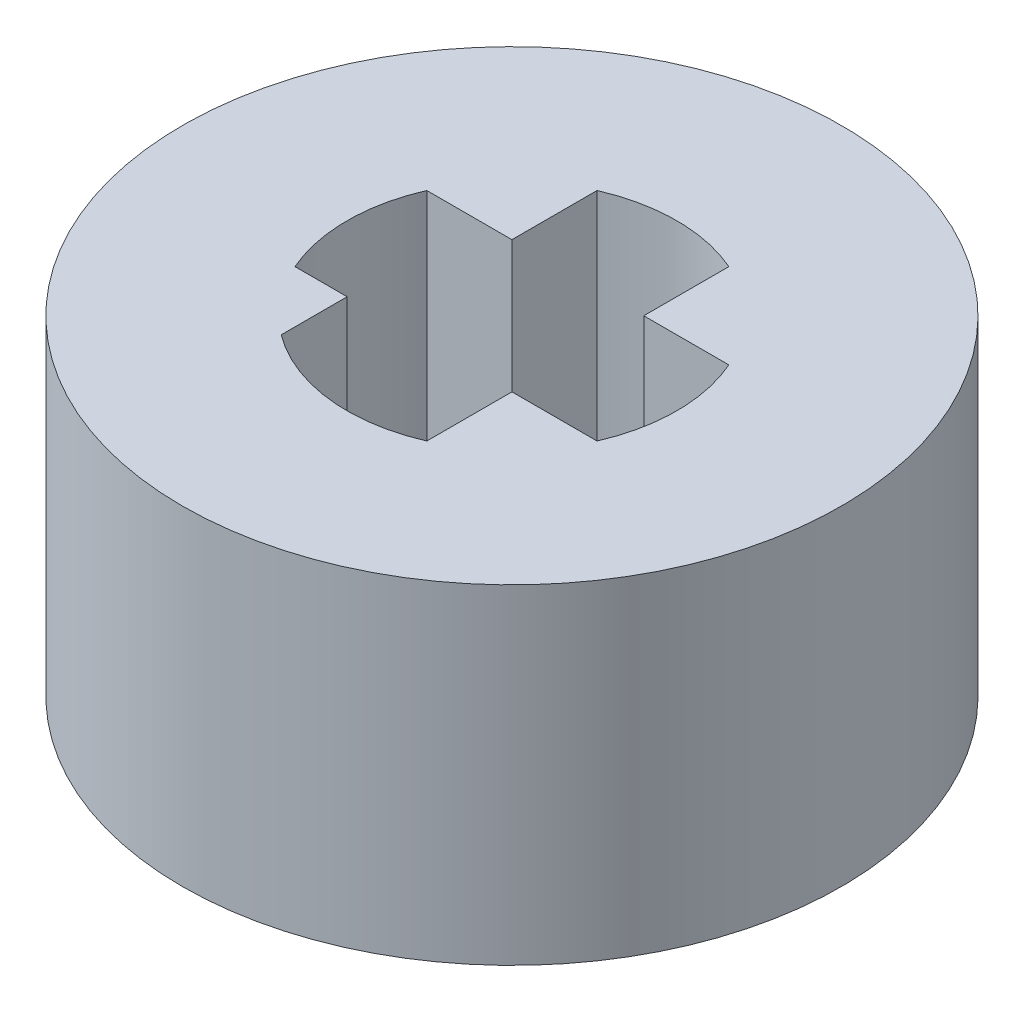
ISO-10303-21;
HEADER;
FILE_DESCRIPTION(('STEP AP214'),'2;1');
FILE_NAME('part.step','',(''),(''),'','','');
FILE_SCHEMA(('AUTOMOTIVE_DESIGN { 1 0 10303 214 1 1 1 1 }'));
ENDSEC;
DATA;
#1=APPLICATION_CONTEXT('core data for automotive mechanical design processes');
#2=APPLICATION_PROTOCOL_DEFINITION('international standard','automotive_design',2000,#1);
#3=PRODUCT_CONTEXT('',#1,'mechanical');
#4=PRODUCT('Part','Part','',(#3));
#5=PRODUCT_RELATED_PRODUCT_CATEGORY('part','',(#4));
#6=PRODUCT_DEFINITION_FORMATION('','',#4);
#7=PRODUCT_DEFINITION_CONTEXT('part definition',#1,'design');
#8=PRODUCT_DEFINITION('design','',#6,#7);
#9=PRODUCT_DEFINITION_SHAPE('','',#8);
#10=(LENGTH_UNIT() NAMED_UNIT(*) SI_UNIT(.MILLI.,.METRE.));
#11=(NAMED_UNIT(*) PLANE_ANGLE_UNIT() SI_UNIT($,.RADIAN.));
#12=(NAMED_UNIT(*) SI_UNIT($,.STERADIAN.) SOLID_ANGLE_UNIT());
#13=UNCERTAINTY_MEASURE_WITH_UNIT(LENGTH_MEASURE(1.E-05),#10,'distance_accuracy_value','');
#14=(GEOMETRIC_REPRESENTATION_CONTEXT(3) GLOBAL_UNCERTAINTY_ASSIGNED_CONTEXT((#13)) GLOBAL_UNIT_ASSIGNED_CONTEXT((#10,
#11,#12)) REPRESENTATION_CONTEXT('',''));
#15=CARTESIAN_POINT('',(0.,0.,0.));
#16=DIRECTION('',(0.,0.,1.));
#17=DIRECTION('',(1.,0.,0.));
#18=AXIS2_PLACEMENT_3D('',#15,#16,#17);
#19=CARTESIAN_POINT('',(0.,5.,0.));
#20=DIRECTION('',(0.,1.,0.));
#21=DIRECTION('',(0.,0.,1.));
#22=AXIS2_PLACEMENT_3D('',#19,#20,#21);
#23=PLANE('',#22);
#24=CARTESIAN_POINT('',(0.,5.,0.));
#25=DIRECTION('',(0.,1.,0.));
#26=DIRECTION('',(0.,0.,1.));
#27=AXIS2_PLACEMENT_3D('',#24,#25,#26);
#28=CIRCLE('',#27,5.);
#29=CARTESIAN_POINT('',(0.,5.,5.));
#30=VERTEX_POINT('',#29);
#31=EDGE_CURVE('E11',#30,#30,#28,.T.);
#32=ORIENTED_EDGE('',*,*,#31,.T.);
#33=EDGE_LOOP('',(#32));
#34=FACE_BOUND('',#33,.T.);
#35=DIRECTION('',(0.,0.,-1.));
#36=VECTOR('',#35,1.);
#37=CARTESIAN_POINT('',(1.,5.,-2.29128784747792));
#38=LINE('',#37,#36);
#39=CARTESIAN_POINT('',(1.,5.,-1.));
#40=VERTEX_POINT('',#39);
#41=CARTESIAN_POINT('',(1.,5.,-2.29128784747792));
#42=VERTEX_POINT('',#41);
#43=EDGE_CURVE('E130',#40,#42,#38,.T.);
#44=ORIENTED_EDGE('',*,*,#43,.F.);
#45=DIRECTION('',(-1.,0.,0.));
#46=VECTOR('',#45,1.);
#47=CARTESIAN_POINT('',(1.,5.,-1.));
#48=LINE('',#47,#46);
#49=CARTESIAN_POINT('',(2.29128784747792,5.,-1.));
#50=VERTEX_POINT('',#49);
#51=EDGE_CURVE('E122',#50,#40,#48,.T.);
#52=ORIENTED_EDGE('',*,*,#51,.F.);
#53=CARTESIAN_POINT('',(0.,5.,0.));
#54=DIRECTION('',(0.,1.,0.));
#55=DIRECTION('',(0.,0.,1.));
#56=AXIS2_PLACEMENT_3D('',#53,#54,#55);
#57=CIRCLE('',#56,2.5);
#58=CARTESIAN_POINT('',(2.29128784747792,5.,0.999999999999999));
#59=VERTEX_POINT('',#58);
#60=EDGE_CURVE('E162',#59,#50,#57,.T.);
#61=ORIENTED_EDGE('',*,*,#60,.F.);
#62=DIRECTION('',(1.,0.,0.));
#63=VECTOR('',#62,1.);
#64=CARTESIAN_POINT('',(1.,5.,1.));
#65=LINE('',#64,#63);
#66=CARTESIAN_POINT('',(1.,5.,1.));
#67=VERTEX_POINT('',#66);
#68=EDGE_CURVE('E160',#67,#59,#65,.T.);
#69=ORIENTED_EDGE('',*,*,#68,.F.);
#70=DIRECTION('',(0.,0.,-1.));
#71=VECTOR('',#70,1.);
#72=CARTESIAN_POINT('',(1.,5.,1.));
#73=LINE('',#72,#71);
#74=CARTESIAN_POINT('',(1.,5.,2.29128784747792));
#75=VERTEX_POINT('',#74);
#76=EDGE_CURVE('E158',#75,#67,#73,.T.);
#77=ORIENTED_EDGE('',*,*,#76,.F.);
#78=CARTESIAN_POINT('',(0.,5.,0.));
#79=DIRECTION('',(0.,1.,0.));
#80=DIRECTION('',(0.,0.,1.));
#81=AXIS2_PLACEMENT_3D('',#78,#79,#80);
#82=CIRCLE('',#81,2.5);
#83=CARTESIAN_POINT('',(-1.5,5.,2.));
#84=VERTEX_POINT('',#83);
#85=EDGE_CURVE('E156',#84,#75,#82,.T.);
#86=ORIENTED_EDGE('',*,*,#85,.F.);
#87=DIRECTION('',(0.,0.,1.));
#88=VECTOR('',#87,1.);
#89=CARTESIAN_POINT('',(-1.5,5.,1.));
#90=LINE('',#89,#88);
#91=CARTESIAN_POINT('',(-1.5,5.,1.));
#92=VERTEX_POINT('',#91);
#93=EDGE_CURVE('E154',#92,#84,#90,.T.);
#94=ORIENTED_EDGE('',*,*,#93,.F.);
#95=DIRECTION('',(1.,0.,0.));
#96=VECTOR('',#95,1.);
#97=CARTESIAN_POINT('',(-2.29128784747792,5.,1.));
#98=LINE('',#97,#96);
#99=CARTESIAN_POINT('',(-2.29128784747792,5.,0.999999999999999));
#100=VERTEX_POINT('',#99);
#101=EDGE_CURVE('E152',#100,#92,#98,.T.);
#102=ORIENTED_EDGE('',*,*,#101,.F.);
#103=CARTESIAN_POINT('',(0.,5.,0.));
#104=DIRECTION('',(0.,1.,0.));
#105=DIRECTION('',(0.,0.,1.));
#106=AXIS2_PLACEMENT_3D('',#103,#104,#105);
#107=CIRCLE('',#106,2.5);
#108=CARTESIAN_POINT('',(-2.29128784747792,5.,-1.));
#109=VERTEX_POINT('',#108);
#110=EDGE_CURVE('E150',#109,#100,#107,.T.);
#111=ORIENTED_EDGE('',*,*,#110,.F.);
#112=DIRECTION('',(-1.,0.,0.));
#113=VECTOR('',#112,1.);
#114=CARTESIAN_POINT('',(-2.29128784747792,5.,-1.));
#115=LINE('',#114,#113);
#116=CARTESIAN_POINT('',(-0.999999999999999,5.,-1.));
#117=VERTEX_POINT('',#116);
#118=EDGE_CURVE('E148',#117,#109,#115,.T.);
#119=ORIENTED_EDGE('',*,*,#118,.F.);
#120=DIRECTION('',(0.,0.,1.));
#121=VECTOR('',#120,1.);
#122=CARTESIAN_POINT('',(-0.999999999999999,5.,-2.29128784747792));
#123=LINE('',#122,#121);
#124=CARTESIAN_POINT('',(-0.999999999999998,5.,-2.29128784747792));
#125=VERTEX_POINT('',#124);
#126=EDGE_CURVE('E144',#125,#117,#123,.T.);
#127=ORIENTED_EDGE('',*,*,#126,.F.);
#128=CARTESIAN_POINT('',(0.,5.,0.));
#129=DIRECTION('',(0.,1.,0.));
#130=DIRECTION('',(0.,0.,1.));
#131=AXIS2_PLACEMENT_3D('',#128,#129,#130);
#132=CIRCLE('',#131,2.5);
#133=EDGE_CURVE('E142',#42,#125,#132,.T.);
#134=ORIENTED_EDGE('',*,*,#133,.F.);
#135=EDGE_LOOP('',(#44,#52,#61,#69,#77,#86,#94,#102,#111,#119,#127,#134));
#136=FACE_BOUND('',#135,.T.);
#137=ADVANCED_FACE('F33',(#34,#136),#23,.T.);
#138=CARTESIAN_POINT('',(0.,0.,0.));
#139=DIRECTION('',(0.,1.,0.));
#140=DIRECTION('',(0.,0.,1.));
#141=AXIS2_PLACEMENT_3D('',#138,#139,#140);
#142=PLANE('',#141);
#143=CARTESIAN_POINT('',(0.,0.,0.));
#144=DIRECTION('',(0.,1.,0.));
#145=DIRECTION('',(0.,0.,1.));
#146=AXIS2_PLACEMENT_3D('',#143,#144,#145);
#147=CIRCLE('',#146,5.);
#148=CARTESIAN_POINT('',(0.,0.,5.));
#149=VERTEX_POINT('',#148);
#150=EDGE_CURVE('E37',#149,#149,#147,.T.);
#151=ORIENTED_EDGE('',*,*,#150,.F.);
#152=EDGE_LOOP('',(#151));
#153=FACE_BOUND('',#152,.T.);
#154=DIRECTION('',(-1.,0.,0.));
#155=VECTOR('',#154,1.);
#156=CARTESIAN_POINT('',(1.,0.,-1.));
#157=LINE('',#156,#155);
#158=CARTESIAN_POINT('',(2.29128784747792,0.,-1.));
#159=VERTEX_POINT('',#158);
#160=CARTESIAN_POINT('',(1.,0.,-1.));
#161=VERTEX_POINT('',#160);
#162=EDGE_CURVE('E56',#159,#161,#157,.T.);
#163=ORIENTED_EDGE('',*,*,#162,.T.);
#164=DIRECTION('',(0.,0.,-1.));
#165=VECTOR('',#164,1.);
#166=CARTESIAN_POINT('',(1.,0.,-2.29128784747792));
#167=LINE('',#166,#165);
#168=CARTESIAN_POINT('',(1.,0.,-2.29128784747792));
#169=VERTEX_POINT('',#168);
#170=EDGE_CURVE('E137',#161,#169,#167,.T.);
#171=ORIENTED_EDGE('',*,*,#170,.T.);
#172=CARTESIAN_POINT('',(0.,0.,0.));
#173=DIRECTION('',(0.,1.,0.));
#174=DIRECTION('',(0.,0.,1.));
#175=AXIS2_PLACEMENT_3D('',#172,#173,#174);
#176=CIRCLE('',#175,2.5);
#177=CARTESIAN_POINT('',(-0.999999999999998,0.,-2.29128784747792));
#178=VERTEX_POINT('',#177);
#179=EDGE_CURVE('E166',#169,#178,#176,.T.);
#180=ORIENTED_EDGE('',*,*,#179,.T.);
#181=DIRECTION('',(0.,0.,1.));
#182=VECTOR('',#181,1.);
#183=CARTESIAN_POINT('',(-0.999999999999999,0.,-2.29128784747792));
#184=LINE('',#183,#182);
#185=CARTESIAN_POINT('',(-0.999999999999999,0.,-1.));
#186=VERTEX_POINT('',#185);
#187=EDGE_CURVE('E169',#178,#186,#184,.T.);
#188=ORIENTED_EDGE('',*,*,#187,.T.);
#189=DIRECTION('',(-1.,0.,0.));
#190=VECTOR('',#189,1.);
#191=CARTESIAN_POINT('',(-2.29128784747792,0.,-1.));
#192=LINE('',#191,#190);
#193=CARTESIAN_POINT('',(-2.29128784747792,0.,-1.));
#194=VERTEX_POINT('',#193);
#195=EDGE_CURVE('E172',#186,#194,#192,.T.);
#196=ORIENTED_EDGE('',*,*,#195,.T.);
#197=CARTESIAN_POINT('',(0.,0.,0.));
#198=DIRECTION('',(0.,1.,0.));
#199=DIRECTION('',(0.,0.,1.));
#200=AXIS2_PLACEMENT_3D('',#197,#198,#199);
#201=CIRCLE('',#200,2.5);
#202=CARTESIAN_POINT('',(-2.29128784747792,0.,0.999999999999999));
#203=VERTEX_POINT('',#202);
#204=EDGE_CURVE('E175',#194,#203,#201,.T.);
#205=ORIENTED_EDGE('',*,*,#204,.T.);
#206=DIRECTION('',(1.,0.,0.));
#207=VECTOR('',#206,1.);
#208=CARTESIAN_POINT('',(-2.29128784747792,0.,1.));
#209=LINE('',#208,#207);
#210=CARTESIAN_POINT('',(-1.5,0.,1.));
#211=VERTEX_POINT('',#210);
#212=EDGE_CURVE('E178',#203,#211,#209,.T.);
#213=ORIENTED_EDGE('',*,*,#212,.T.);
#214=DIRECTION('',(0.,0.,1.));
#215=VECTOR('',#214,1.);
#216=CARTESIAN_POINT('',(-1.5,0.,1.));
#217=LINE('',#216,#215);
#218=CARTESIAN_POINT('',(-1.5,0.,2.));
#219=VERTEX_POINT('',#218);
#220=EDGE_CURVE('E181',#211,#219,#217,.T.);
#221=ORIENTED_EDGE('',*,*,#220,.T.);
#222=CARTESIAN_POINT('',(0.,0.,0.));
#223=DIRECTION('',(0.,1.,0.));
#224=DIRECTION('',(0.,0.,1.));
#225=AXIS2_PLACEMENT_3D('',#222,#223,#224);
#226=CIRCLE('',#225,2.5);
#227=CARTESIAN_POINT('',(1.,0.,2.29128784747792));
#228=VERTEX_POINT('',#227);
#229=EDGE_CURVE('E184',#219,#228,#226,.T.);
#230=ORIENTED_EDGE('',*,*,#229,.T.);
#231=DIRECTION('',(0.,0.,-1.));
#232=VECTOR('',#231,1.);
#233=CARTESIAN_POINT('',(1.,0.,1.));
#234=LINE('',#233,#232);
#235=CARTESIAN_POINT('',(1.,0.,1.));
#236=VERTEX_POINT('',#235);
#237=EDGE_CURVE('E187',#228,#236,#234,.T.);
#238=ORIENTED_EDGE('',*,*,#237,.T.);
#239=DIRECTION('',(1.,0.,0.));
#240=VECTOR('',#239,1.);
#241=CARTESIAN_POINT('',(1.,0.,1.));
#242=LINE('',#241,#240);
#243=CARTESIAN_POINT('',(2.29128784747792,0.,0.999999999999999));
#244=VERTEX_POINT('',#243);
#245=EDGE_CURVE('E190',#236,#244,#242,.T.);
#246=ORIENTED_EDGE('',*,*,#245,.T.);
#247=CARTESIAN_POINT('',(0.,0.,0.));
#248=DIRECTION('',(0.,1.,0.));
#249=DIRECTION('',(0.,0.,1.));
#250=AXIS2_PLACEMENT_3D('',#247,#248,#249);
#251=CIRCLE('',#250,2.5);
#252=EDGE_CURVE('E131',#244,#159,#251,.T.);
#253=ORIENTED_EDGE('',*,*,#252,.T.);
#254=EDGE_LOOP('',(#163,#171,#180,#188,#196,#205,#213,#221,#230,#238,#246,#253));
#255=FACE_BOUND('',#254,.T.);
#256=ADVANCED_FACE('F219',(#153,#255),#142,.F.);
#257=CARTESIAN_POINT('',(0.,5.,0.));
#258=DIRECTION('',(0.,-1.,0.));
#259=DIRECTION('',(0.,0.,-1.));
#260=AXIS2_PLACEMENT_3D('',#257,#258,#259);
#261=CYLINDRICAL_SURFACE('',#260,5.);
#262=ORIENTED_EDGE('',*,*,#31,.F.);
#263=EDGE_LOOP('',(#262));
#264=FACE_BOUND('',#263,.T.);
#265=ORIENTED_EDGE('',*,*,#150,.T.);
#266=EDGE_LOOP('',(#265));
#267=FACE_BOUND('',#266,.T.);
#268=ADVANCED_FACE('F35',(#264,#267),#261,.T.);
#269=CARTESIAN_POINT('',(1.,5.,-1.));
#270=DIRECTION('',(0.,0.,1.));
#271=DIRECTION('',(1.,0.,0.));
#272=AXIS2_PLACEMENT_3D('',#269,#270,#271);
#273=PLANE('',#272);
#274=ORIENTED_EDGE('',*,*,#162,.F.);
#275=DIRECTION('',(0.,-1.,0.));
#276=VECTOR('',#275,1.);
#277=CARTESIAN_POINT('',(2.29128784747792,5.,-1.));
#278=LINE('',#277,#276);
#279=EDGE_CURVE('E126',#50,#159,#278,.T.);
#280=ORIENTED_EDGE('',*,*,#279,.F.);
#281=ORIENTED_EDGE('',*,*,#51,.T.);
#282=DIRECTION('',(0.,-1.,0.));
#283=VECTOR('',#282,1.);
#284=CARTESIAN_POINT('',(1.,5.,-1.));
#285=LINE('',#284,#283);
#286=EDGE_CURVE('E125',#40,#161,#285,.T.);
#287=ORIENTED_EDGE('',*,*,#286,.T.);
#288=EDGE_LOOP('',(#274,#280,#281,#287));
#289=FACE_BOUND('',#288,.T.);
#290=ADVANCED_FACE('F124',(#289),#273,.T.);
#291=CARTESIAN_POINT('',(1.,5.,-2.29128784747792));
#292=DIRECTION('',(-1.,0.,0.));
#293=DIRECTION('',(0.,0.,1.));
#294=AXIS2_PLACEMENT_3D('',#291,#292,#293);
#295=PLANE('',#294);
#296=ORIENTED_EDGE('',*,*,#170,.F.);
#297=ORIENTED_EDGE('',*,*,#286,.F.);
#298=ORIENTED_EDGE('',*,*,#43,.T.);
#299=DIRECTION('',(0.,-1.,0.));
#300=VECTOR('',#299,1.);
#301=CARTESIAN_POINT('',(1.,5.,-2.29128784747792));
#302=LINE('',#301,#300);
#303=EDGE_CURVE('E138',#42,#169,#302,.T.);
#304=ORIENTED_EDGE('',*,*,#303,.T.);
#305=EDGE_LOOP('',(#296,#297,#298,#304));
#306=FACE_BOUND('',#305,.T.);
#307=ADVANCED_FACE('F134',(#306),#295,.T.);
#308=CARTESIAN_POINT('',(0.,5.,0.));
#309=DIRECTION('',(0.,-1.,0.));
#310=DIRECTION('',(0.,0.,-1.));
#311=AXIS2_PLACEMENT_3D('',#308,#309,#310);
#312=CYLINDRICAL_SURFACE('',#311,2.5);
#313=ORIENTED_EDGE('',*,*,#179,.F.);
#314=ORIENTED_EDGE('',*,*,#303,.F.);
#315=ORIENTED_EDGE('',*,*,#133,.T.);
#316=DIRECTION('',(0.,-1.,0.));
#317=VECTOR('',#316,1.);
#318=CARTESIAN_POINT('',(-0.999999999999998,5.,-2.29128784747792));
#319=LINE('',#318,#317);
#320=EDGE_CURVE('E211',#125,#178,#319,.T.);
#321=ORIENTED_EDGE('',*,*,#320,.T.);
#322=EDGE_LOOP('',(#313,#314,#315,#321));
#323=FACE_BOUND('',#322,.T.);
#324=ADVANCED_FACE('F215',(#323),#312,.F.);
#325=CARTESIAN_POINT('',(-0.999999999999999,5.,-2.29128784747792));
#326=DIRECTION('',(1.,0.,0.));
#327=DIRECTION('',(0.,0.,-1.));
#328=AXIS2_PLACEMENT_3D('',#325,#326,#327);
#329=PLANE('',#328);
#330=ORIENTED_EDGE('',*,*,#187,.F.);
#331=ORIENTED_EDGE('',*,*,#320,.F.);
#332=ORIENTED_EDGE('',*,*,#126,.T.);
#333=DIRECTION('',(0.,-1.,0.));
#334=VECTOR('',#333,1.);
#335=CARTESIAN_POINT('',(-0.999999999999999,5.,-1.));
#336=LINE('',#335,#334);
#337=EDGE_CURVE('E209',#117,#186,#336,.T.);
#338=ORIENTED_EDGE('',*,*,#337,.T.);
#339=EDGE_LOOP('',(#330,#331,#332,#338));
#340=FACE_BOUND('',#339,.T.);
#341=ADVANCED_FACE('F257',(#340),#329,.T.);
#342=CARTESIAN_POINT('',(-2.29128784747792,5.,-1.));
#343=DIRECTION('',(0.,0.,1.));
#344=DIRECTION('',(1.,0.,0.));
#345=AXIS2_PLACEMENT_3D('',#342,#343,#344);
#346=PLANE('',#345);
#347=ORIENTED_EDGE('',*,*,#195,.F.);
#348=ORIENTED_EDGE('',*,*,#337,.F.);
#349=ORIENTED_EDGE('',*,*,#118,.T.);
#350=DIRECTION('',(0.,-1.,0.));
#351=VECTOR('',#350,1.);
#352=CARTESIAN_POINT('',(-2.29128784747792,5.,-1.));
#353=LINE('',#352,#351);
#354=EDGE_CURVE('E207',#109,#194,#353,.T.);
#355=ORIENTED_EDGE('',*,*,#354,.T.);
#356=EDGE_LOOP('',(#347,#348,#349,#355));
#357=FACE_BOUND('',#356,.T.);
#358=ADVANCED_FACE('F255',(#357),#346,.T.);
#359=CARTESIAN_POINT('',(0.,5.,0.));
#360=DIRECTION('',(0.,-1.,0.));
#361=DIRECTION('',(0.,0.,-1.));
#362=AXIS2_PLACEMENT_3D('',#359,#360,#361);
#363=CYLINDRICAL_SURFACE('',#362,2.5);
#364=ORIENTED_EDGE('',*,*,#204,.F.);
#365=ORIENTED_EDGE('',*,*,#354,.F.);
#366=ORIENTED_EDGE('',*,*,#110,.T.);
#367=DIRECTION('',(0.,-1.,0.));
#368=VECTOR('',#367,1.);
#369=CARTESIAN_POINT('',(-2.29128784747792,5.,0.999999999999999));
#370=LINE('',#369,#368);
#371=EDGE_CURVE('E205',#100,#203,#370,.T.);
#372=ORIENTED_EDGE('',*,*,#371,.T.);
#373=EDGE_LOOP('',(#364,#365,#366,#372));
#374=FACE_BOUND('',#373,.T.);
#375=ADVANCED_FACE('F249',(#374),#363,.F.);
#376=CARTESIAN_POINT('',(-2.29128784747792,5.,1.));
#377=DIRECTION('',(0.,0.,-1.));
#378=DIRECTION('',(-1.,0.,0.));
#379=AXIS2_PLACEMENT_3D('',#376,#377,#378);
#380=PLANE('',#379);
#381=ORIENTED_EDGE('',*,*,#212,.F.);
#382=ORIENTED_EDGE('',*,*,#371,.F.);
#383=ORIENTED_EDGE('',*,*,#101,.T.);
#384=DIRECTION('',(0.,-1.,0.));
#385=VECTOR('',#384,1.);
#386=CARTESIAN_POINT('',(-1.5,5.,1.));
#387=LINE('',#386,#385);
#388=EDGE_CURVE('E203',#92,#211,#387,.T.);
#389=ORIENTED_EDGE('',*,*,#388,.T.);
#390=EDGE_LOOP('',(#381,#382,#383,#389));
#391=FACE_BOUND('',#390,.T.);
#392=ADVANCED_FACE('F245',(#391),#380,.T.);
#393=CARTESIAN_POINT('',(-1.5,5.,1.));
#394=DIRECTION('',(1.,0.,0.));
#395=DIRECTION('',(0.,0.,-1.));
#396=AXIS2_PLACEMENT_3D('',#393,#394,#395);
#397=PLANE('',#396);
#398=ORIENTED_EDGE('',*,*,#220,.F.);
#399=ORIENTED_EDGE('',*,*,#388,.F.);
#400=ORIENTED_EDGE('',*,*,#93,.T.);
#401=DIRECTION('',(0.,-1.,0.));
#402=VECTOR('',#401,1.);
#403=CARTESIAN_POINT('',(-1.5,5.,2.));
#404=LINE('',#403,#402);
#405=EDGE_CURVE('E201',#84,#219,#404,.T.);
#406=ORIENTED_EDGE('',*,*,#405,.T.);
#407=EDGE_LOOP('',(#398,#399,#400,#406));
#408=FACE_BOUND('',#407,.T.);
#409=ADVANCED_FACE('F242',(#408),#397,.T.);
#410=CARTESIAN_POINT('',(0.,5.,0.));
#411=DIRECTION('',(0.,-1.,0.));
#412=DIRECTION('',(0.,0.,-1.));
#413=AXIS2_PLACEMENT_3D('',#410,#411,#412);
#414=CYLINDRICAL_SURFACE('',#413,2.5);
#415=ORIENTED_EDGE('',*,*,#229,.F.);
#416=ORIENTED_EDGE('',*,*,#405,.F.);
#417=ORIENTED_EDGE('',*,*,#85,.T.);
#418=DIRECTION('',(0.,-1.,0.));
#419=VECTOR('',#418,1.);
#420=CARTESIAN_POINT('',(1.,5.,2.29128784747792));
#421=LINE('',#420,#419);
#422=EDGE_CURVE('E199',#75,#228,#421,.T.);
#423=ORIENTED_EDGE('',*,*,#422,.T.);
#424=EDGE_LOOP('',(#415,#416,#417,#423));
#425=FACE_BOUND('',#424,.T.);
#426=ADVANCED_FACE('F234',(#425),#414,.F.);
#427=CARTESIAN_POINT('',(1.,5.,1.));
#428=DIRECTION('',(-1.,0.,0.));
#429=DIRECTION('',(0.,0.,1.));
#430=AXIS2_PLACEMENT_3D('',#427,#428,#429);
#431=PLANE('',#430);
#432=ORIENTED_EDGE('',*,*,#237,.F.);
#433=ORIENTED_EDGE('',*,*,#422,.F.);
#434=ORIENTED_EDGE('',*,*,#76,.T.);
#435=DIRECTION('',(0.,-1.,0.));
#436=VECTOR('',#435,1.);
#437=CARTESIAN_POINT('',(1.,5.,1.));
#438=LINE('',#437,#436);
#439=EDGE_CURVE('E197',#67,#236,#438,.T.);
#440=ORIENTED_EDGE('',*,*,#439,.T.);
#441=EDGE_LOOP('',(#432,#433,#434,#440));
#442=FACE_BOUND('',#441,.T.);
#443=ADVANCED_FACE('F230',(#442),#431,.T.);
#444=CARTESIAN_POINT('',(1.,5.,1.));
#445=DIRECTION('',(0.,0.,-1.));
#446=DIRECTION('',(-1.,0.,0.));
#447=AXIS2_PLACEMENT_3D('',#444,#445,#446);
#448=PLANE('',#447);
#449=ORIENTED_EDGE('',*,*,#245,.F.);
#450=ORIENTED_EDGE('',*,*,#439,.F.);
#451=ORIENTED_EDGE('',*,*,#68,.T.);
#452=DIRECTION('',(0.,-1.,0.));
#453=VECTOR('',#452,1.);
#454=CARTESIAN_POINT('',(2.29128784747792,5.,0.999999999999999));
#455=LINE('',#454,#453);
#456=EDGE_CURVE('E48',#59,#244,#455,.T.);
#457=ORIENTED_EDGE('',*,*,#456,.T.);
#458=EDGE_LOOP('',(#449,#450,#451,#457));
#459=FACE_BOUND('',#458,.T.);
#460=ADVANCED_FACE('F227',(#459),#448,.T.);
#461=CARTESIAN_POINT('',(0.,5.,0.));
#462=DIRECTION('',(0.,-1.,0.));
#463=DIRECTION('',(0.,0.,-1.));
#464=AXIS2_PLACEMENT_3D('',#461,#462,#463);
#465=CYLINDRICAL_SURFACE('',#464,2.5);
#466=ORIENTED_EDGE('',*,*,#252,.F.);
#467=ORIENTED_EDGE('',*,*,#456,.F.);
#468=ORIENTED_EDGE('',*,*,#60,.T.);
#469=ORIENTED_EDGE('',*,*,#279,.T.);
#470=EDGE_LOOP('',(#466,#467,#468,#469));
#471=FACE_BOUND('',#470,.T.);
#472=ADVANCED_FACE('F221',(#471),#465,.F.);
#473=CLOSED_SHELL('',(#137,#256,#268,#290,#307,#324,#341,#358,#375,#392,#409,#426,#443,#460,#472));
#474=MANIFOLD_SOLID_BREP('B2',#473);
#475=ADVANCED_BREP_SHAPE_REPRESENTATION('',(#18,#474),#14);
#476=SHAPE_DEFINITION_REPRESENTATION(#9,#475);
ENDSEC;
END-ISO-10303-21;
